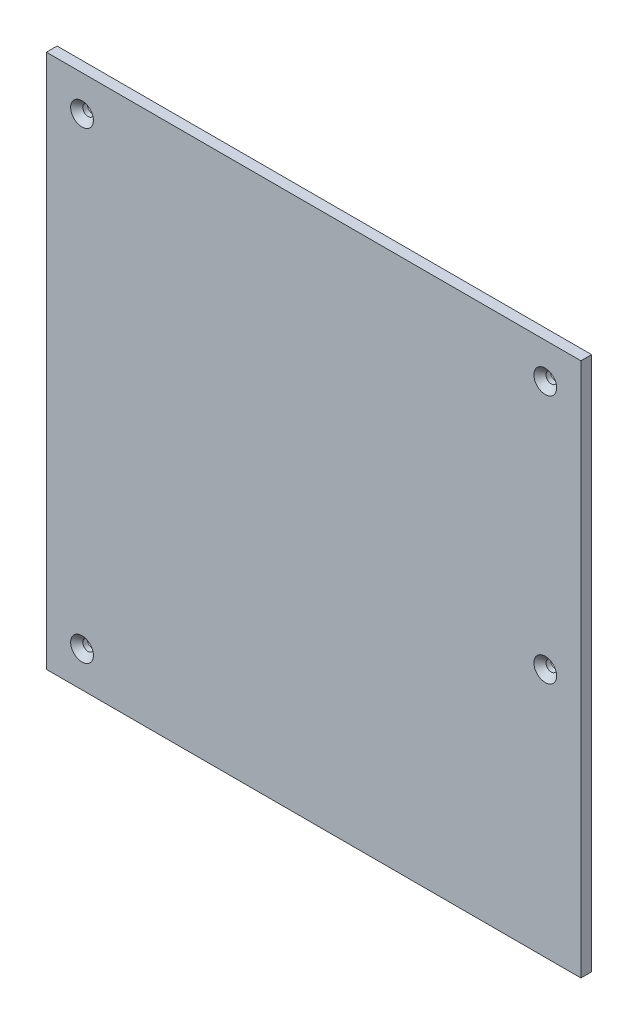
ISO-10303-21;
HEADER;
FILE_DESCRIPTION(('STEP AP214'),'2;1');
FILE_NAME('part.step','',(''),(''),'','','');
FILE_SCHEMA(('AUTOMOTIVE_DESIGN { 1 0 10303 214 1 1 1 1 }'));
ENDSEC;
DATA;
#1=APPLICATION_CONTEXT('core data for automotive mechanical design processes');
#2=APPLICATION_PROTOCOL_DEFINITION('international standard','automotive_design',2000,#1);
#3=PRODUCT_CONTEXT('',#1,'mechanical');
#4=PRODUCT('Part','Part','',(#3));
#5=PRODUCT_RELATED_PRODUCT_CATEGORY('part','',(#4));
#6=PRODUCT_DEFINITION_FORMATION('','',#4);
#7=PRODUCT_DEFINITION_CONTEXT('part definition',#1,'design');
#8=PRODUCT_DEFINITION('design','',#6,#7);
#9=PRODUCT_DEFINITION_SHAPE('','',#8);
#10=(LENGTH_UNIT() NAMED_UNIT(*) SI_UNIT(.MILLI.,.METRE.));
#11=(NAMED_UNIT(*) PLANE_ANGLE_UNIT() SI_UNIT($,.RADIAN.));
#12=(NAMED_UNIT(*) SI_UNIT($,.STERADIAN.) SOLID_ANGLE_UNIT());
#13=UNCERTAINTY_MEASURE_WITH_UNIT(LENGTH_MEASURE(1.E-05),#10,'distance_accuracy_value','');
#14=(GEOMETRIC_REPRESENTATION_CONTEXT(3) GLOBAL_UNCERTAINTY_ASSIGNED_CONTEXT((#13)) GLOBAL_UNIT_ASSIGNED_CONTEXT((#10,
#11,#12)) REPRESENTATION_CONTEXT('',''));
#15=CARTESIAN_POINT('',(0.,0.,0.));
#16=DIRECTION('',(0.,0.,1.));
#17=DIRECTION('',(1.,0.,0.));
#18=AXIS2_PLACEMENT_3D('',#15,#16,#17);
#19=CARTESIAN_POINT('',(75.,75.,3.));
#20=DIRECTION('',(-1.,0.,0.));
#21=DIRECTION('',(0.,-1.,0.));
#22=AXIS2_PLACEMENT_3D('',#19,#20,#21);
#23=PLANE('',#22);
#24=DIRECTION('',(0.,1.,0.));
#25=VECTOR('',#24,1.);
#26=CARTESIAN_POINT('',(75.,75.,0.));
#27=LINE('',#26,#25);
#28=CARTESIAN_POINT('',(75.,-75.,0.));
#29=VERTEX_POINT('',#28);
#30=CARTESIAN_POINT('',(75.,75.,0.));
#31=VERTEX_POINT('',#30);
#32=EDGE_CURVE('E103',#29,#31,#27,.T.);
#33=ORIENTED_EDGE('',*,*,#32,.T.);
#34=DIRECTION('',(0.,0.,-1.));
#35=VECTOR('',#34,1.);
#36=CARTESIAN_POINT('',(75.,75.,3.));
#37=LINE('',#36,#35);
#38=CARTESIAN_POINT('',(75.,75.,3.));
#39=VERTEX_POINT('',#38);
#40=EDGE_CURVE('E94',#39,#31,#37,.T.);
#41=ORIENTED_EDGE('',*,*,#40,.F.);
#42=DIRECTION('',(0.,1.,0.));
#43=VECTOR('',#42,1.);
#44=CARTESIAN_POINT('',(75.,75.,3.));
#45=LINE('',#44,#43);
#46=CARTESIAN_POINT('',(75.,-75.,3.));
#47=VERTEX_POINT('',#46);
#48=EDGE_CURVE('E88',#47,#39,#45,.T.);
#49=ORIENTED_EDGE('',*,*,#48,.F.);
#50=DIRECTION('',(0.,0.,-1.));
#51=VECTOR('',#50,1.);
#52=CARTESIAN_POINT('',(75.,-75.,3.));
#53=LINE('',#52,#51);
#54=EDGE_CURVE('E99',#47,#29,#53,.T.);
#55=ORIENTED_EDGE('',*,*,#54,.T.);
#56=EDGE_LOOP('',(#33,#41,#49,#55));
#57=FACE_BOUND('',#56,.T.);
#58=ADVANCED_FACE('F35',(#57),#23,.F.);
#59=CARTESIAN_POINT('',(-75.,75.,3.));
#60=DIRECTION('',(0.,-1.,0.));
#61=DIRECTION('',(0.,0.,-1.));
#62=AXIS2_PLACEMENT_3D('',#59,#60,#61);
#63=PLANE('',#62);
#64=DIRECTION('',(-1.,0.,0.));
#65=VECTOR('',#64,1.);
#66=CARTESIAN_POINT('',(-75.,75.,0.));
#67=LINE('',#66,#65);
#68=CARTESIAN_POINT('',(-75.,75.,0.));
#69=VERTEX_POINT('',#68);
#70=EDGE_CURVE('E93',#31,#69,#67,.T.);
#71=ORIENTED_EDGE('',*,*,#70,.T.);
#72=DIRECTION('',(0.,0.,-1.));
#73=VECTOR('',#72,1.);
#74=CARTESIAN_POINT('',(-75.,75.,3.));
#75=LINE('',#74,#73);
#76=CARTESIAN_POINT('',(-75.,75.,3.));
#77=VERTEX_POINT('',#76);
#78=EDGE_CURVE('E91',#77,#69,#75,.T.);
#79=ORIENTED_EDGE('',*,*,#78,.F.);
#80=DIRECTION('',(-1.,0.,0.));
#81=VECTOR('',#80,1.);
#82=CARTESIAN_POINT('',(-75.,75.,3.));
#83=LINE('',#82,#81);
#84=EDGE_CURVE('E83',#39,#77,#83,.T.);
#85=ORIENTED_EDGE('',*,*,#84,.F.);
#86=ORIENTED_EDGE('',*,*,#40,.T.);
#87=EDGE_LOOP('',(#71,#79,#85,#86));
#88=FACE_BOUND('',#87,.T.);
#89=ADVANCED_FACE('F92',(#88),#63,.F.);
#90=CARTESIAN_POINT('',(-75.,75.,3.));
#91=DIRECTION('',(1.,0.,0.));
#92=DIRECTION('',(0.,1.,0.));
#93=AXIS2_PLACEMENT_3D('',#90,#91,#92);
#94=PLANE('',#93);
#95=DIRECTION('',(0.,-1.,0.));
#96=VECTOR('',#95,1.);
#97=CARTESIAN_POINT('',(-75.,75.,0.));
#98=LINE('',#97,#96);
#99=CARTESIAN_POINT('',(-75.,-75.,0.));
#100=VERTEX_POINT('',#99);
#101=EDGE_CURVE('E69',#69,#100,#98,.T.);
#102=ORIENTED_EDGE('',*,*,#101,.T.);
#103=DIRECTION('',(0.,0.,-1.));
#104=VECTOR('',#103,1.);
#105=CARTESIAN_POINT('',(-75.,-75.,3.));
#106=LINE('',#105,#104);
#107=CARTESIAN_POINT('',(-75.,-75.,3.));
#108=VERTEX_POINT('',#107);
#109=EDGE_CURVE('E95',#108,#100,#106,.T.);
#110=ORIENTED_EDGE('',*,*,#109,.F.);
#111=DIRECTION('',(0.,-1.,0.));
#112=VECTOR('',#111,1.);
#113=CARTESIAN_POINT('',(-75.,75.,3.));
#114=LINE('',#113,#112);
#115=EDGE_CURVE('E86',#77,#108,#114,.T.);
#116=ORIENTED_EDGE('',*,*,#115,.F.);
#117=ORIENTED_EDGE('',*,*,#78,.T.);
#118=EDGE_LOOP('',(#102,#110,#116,#117));
#119=FACE_BOUND('',#118,.T.);
#120=ADVANCED_FACE('F97',(#119),#94,.F.);
#121=CARTESIAN_POINT('',(-75.,-75.,3.));
#122=DIRECTION('',(0.,1.,0.));
#123=DIRECTION('',(0.,0.,1.));
#124=AXIS2_PLACEMENT_3D('',#121,#122,#123);
#125=PLANE('',#124);
#126=DIRECTION('',(1.,0.,0.));
#127=VECTOR('',#126,1.);
#128=CARTESIAN_POINT('',(-75.,-75.,0.));
#129=LINE('',#128,#127);
#130=EDGE_CURVE('E75',#100,#29,#129,.T.);
#131=ORIENTED_EDGE('',*,*,#130,.T.);
#132=ORIENTED_EDGE('',*,*,#54,.F.);
#133=DIRECTION('',(1.,0.,0.));
#134=VECTOR('',#133,1.);
#135=CARTESIAN_POINT('',(-75.,-75.,3.));
#136=LINE('',#135,#134);
#137=EDGE_CURVE('E52',#108,#47,#136,.T.);
#138=ORIENTED_EDGE('',*,*,#137,.F.);
#139=ORIENTED_EDGE('',*,*,#109,.T.);
#140=EDGE_LOOP('',(#131,#132,#138,#139));
#141=FACE_BOUND('',#140,.T.);
#142=ADVANCED_FACE('F145',(#141),#125,.F.);
#143=CARTESIAN_POINT('',(0.,0.,3.));
#144=DIRECTION('',(0.,0.,1.));
#145=DIRECTION('',(1.,0.,0.));
#146=AXIS2_PLACEMENT_3D('',#143,#144,#145);
#147=PLANE('',#146);
#148=CARTESIAN_POINT('',(-65.,-65.,3.));
#149=DIRECTION('',(0.,0.,1.));
#150=DIRECTION('',(1.,0.,0.));
#151=AXIS2_PLACEMENT_3D('',#148,#149,#150);
#152=CIRCLE('',#151,3.20000000000001);
#153=CARTESIAN_POINT('',(-61.8,-65.,3.));
#154=VERTEX_POINT('',#153);
#155=EDGE_CURVE('E122',#154,#154,#152,.F.);
#156=ORIENTED_EDGE('',*,*,#155,.T.);
#157=EDGE_LOOP('',(#156));
#158=FACE_BOUND('',#157,.T.);
#159=CARTESIAN_POINT('',(65.,-5.,3.));
#160=DIRECTION('',(0.,0.,1.));
#161=DIRECTION('',(1.,0.,0.));
#162=AXIS2_PLACEMENT_3D('',#159,#160,#161);
#163=CIRCLE('',#162,3.19999999999997);
#164=CARTESIAN_POINT('',(68.2,-5.,3.));
#165=VERTEX_POINT('',#164);
#166=EDGE_CURVE('E119',#165,#165,#163,.F.);
#167=ORIENTED_EDGE('',*,*,#166,.T.);
#168=EDGE_LOOP('',(#167));
#169=FACE_BOUND('',#168,.T.);
#170=CARTESIAN_POINT('',(65.,65.,3.));
#171=DIRECTION('',(0.,0.,1.));
#172=DIRECTION('',(1.,0.,0.));
#173=AXIS2_PLACEMENT_3D('',#170,#171,#172);
#174=CIRCLE('',#173,3.19999999999999);
#175=CARTESIAN_POINT('',(68.2,65.,3.));
#176=VERTEX_POINT('',#175);
#177=EDGE_CURVE('E116',#176,#176,#174,.F.);
#178=ORIENTED_EDGE('',*,*,#177,.T.);
#179=EDGE_LOOP('',(#178));
#180=FACE_BOUND('',#179,.T.);
#181=CARTESIAN_POINT('',(-65.,65.,3.));
#182=DIRECTION('',(0.,0.,1.));
#183=DIRECTION('',(1.,0.,0.));
#184=AXIS2_PLACEMENT_3D('',#181,#182,#183);
#185=CIRCLE('',#184,3.20000000000001);
#186=CARTESIAN_POINT('',(-61.8,65.,3.));
#187=VERTEX_POINT('',#186);
#188=EDGE_CURVE('E113',#187,#187,#185,.F.);
#189=ORIENTED_EDGE('',*,*,#188,.T.);
#190=EDGE_LOOP('',(#189));
#191=FACE_BOUND('',#190,.T.);
#192=ORIENTED_EDGE('',*,*,#48,.T.);
#193=ORIENTED_EDGE('',*,*,#84,.T.);
#194=ORIENTED_EDGE('',*,*,#115,.T.);
#195=ORIENTED_EDGE('',*,*,#137,.T.);
#196=EDGE_LOOP('',(#192,#193,#194,#195));
#197=FACE_BOUND('',#196,.T.);
#198=ADVANCED_FACE('F84',(#158,#169,#180,#191,#197),#147,.T.);
#199=CARTESIAN_POINT('',(0.,0.,0.));
#200=DIRECTION('',(0.,0.,1.));
#201=DIRECTION('',(1.,0.,0.));
#202=AXIS2_PLACEMENT_3D('',#199,#200,#201);
#203=PLANE('',#202);
#204=CARTESIAN_POINT('',(-65.,-65.,0.));
#205=DIRECTION('',(0.,0.,-1.));
#206=DIRECTION('',(-1.,0.,0.));
#207=AXIS2_PLACEMENT_3D('',#204,#205,#206);
#208=CIRCLE('',#207,1.5);
#209=CARTESIAN_POINT('',(-66.5,-65.,0.));
#210=VERTEX_POINT('',#209);
#211=EDGE_CURVE('E106',#210,#210,#208,.T.);
#212=ORIENTED_EDGE('',*,*,#211,.F.);
#213=EDGE_LOOP('',(#212));
#214=FACE_BOUND('',#213,.T.);
#215=CARTESIAN_POINT('',(-65.,65.,0.));
#216=DIRECTION('',(0.,0.,-1.));
#217=DIRECTION('',(-1.,0.,0.));
#218=AXIS2_PLACEMENT_3D('',#215,#216,#217);
#219=CIRCLE('',#218,1.5);
#220=CARTESIAN_POINT('',(-66.5,65.,0.));
#221=VERTEX_POINT('',#220);
#222=EDGE_CURVE('E189',#221,#221,#219,.T.);
#223=ORIENTED_EDGE('',*,*,#222,.F.);
#224=EDGE_LOOP('',(#223));
#225=FACE_BOUND('',#224,.T.);
#226=CARTESIAN_POINT('',(65.,65.,0.));
#227=DIRECTION('',(0.,0.,-1.));
#228=DIRECTION('',(-1.,0.,0.));
#229=AXIS2_PLACEMENT_3D('',#226,#227,#228);
#230=CIRCLE('',#229,1.5);
#231=CARTESIAN_POINT('',(63.5,65.,0.));
#232=VERTEX_POINT('',#231);
#233=EDGE_CURVE('E186',#232,#232,#230,.T.);
#234=ORIENTED_EDGE('',*,*,#233,.F.);
#235=EDGE_LOOP('',(#234));
#236=FACE_BOUND('',#235,.T.);
#237=CARTESIAN_POINT('',(65.,-5.,0.));
#238=DIRECTION('',(0.,0.,-1.));
#239=DIRECTION('',(-1.,0.,0.));
#240=AXIS2_PLACEMENT_3D('',#237,#238,#239);
#241=CIRCLE('',#240,1.5);
#242=CARTESIAN_POINT('',(63.5,-5.,0.));
#243=VERTEX_POINT('',#242);
#244=EDGE_CURVE('E184',#243,#243,#241,.T.);
#245=ORIENTED_EDGE('',*,*,#244,.F.);
#246=EDGE_LOOP('',(#245));
#247=FACE_BOUND('',#246,.T.);
#248=ORIENTED_EDGE('',*,*,#32,.F.);
#249=ORIENTED_EDGE('',*,*,#130,.F.);
#250=ORIENTED_EDGE('',*,*,#101,.F.);
#251=ORIENTED_EDGE('',*,*,#70,.F.);
#252=EDGE_LOOP('',(#248,#249,#250,#251));
#253=FACE_BOUND('',#252,.T.);
#254=ADVANCED_FACE('F144',(#214,#225,#236,#247,#253),#203,.F.);
#255=CARTESIAN_POINT('',(65.,-5.,7.24264068711929));
#256=DIRECTION('',(0.,0.,-1.));
#257=DIRECTION('',(-1.,0.,0.));
#258=AXIS2_PLACEMENT_3D('',#255,#256,#257);
#259=CYLINDRICAL_SURFACE('',#258,1.5);
#260=CARTESIAN_POINT('',(65.,-5.,1.30000000000001));
#261=DIRECTION('',(0.,0.,1.));
#262=DIRECTION('',(1.,0.,0.));
#263=AXIS2_PLACEMENT_3D('',#260,#261,#262);
#264=CIRCLE('',#263,1.5);
#265=CARTESIAN_POINT('',(66.5,-5.,1.30000000000001));
#266=VERTEX_POINT('',#265);
#267=EDGE_CURVE('E128',#266,#266,#264,.T.);
#268=ORIENTED_EDGE('',*,*,#267,.T.);
#269=EDGE_LOOP('',(#268));
#270=FACE_BOUND('',#269,.T.);
#271=ORIENTED_EDGE('',*,*,#244,.T.);
#272=EDGE_LOOP('',(#271));
#273=FACE_BOUND('',#272,.T.);
#274=ADVANCED_FACE('F178',(#270,#273),#259,.F.);
#275=CARTESIAN_POINT('',(65.,65.,7.24264068711929));
#276=DIRECTION('',(0.,0.,-1.));
#277=DIRECTION('',(-1.,0.,0.));
#278=AXIS2_PLACEMENT_3D('',#275,#276,#277);
#279=CYLINDRICAL_SURFACE('',#278,1.5);
#280=CARTESIAN_POINT('',(65.,65.,1.29999999999998));
#281=DIRECTION('',(0.,0.,1.));
#282=DIRECTION('',(1.,0.,0.));
#283=AXIS2_PLACEMENT_3D('',#280,#281,#282);
#284=CIRCLE('',#283,1.5);
#285=CARTESIAN_POINT('',(66.5,65.,1.29999999999998));
#286=VERTEX_POINT('',#285);
#287=EDGE_CURVE('E44',#286,#286,#284,.T.);
#288=ORIENTED_EDGE('',*,*,#287,.T.);
#289=EDGE_LOOP('',(#288));
#290=FACE_BOUND('',#289,.T.);
#291=ORIENTED_EDGE('',*,*,#233,.T.);
#292=EDGE_LOOP('',(#291));
#293=FACE_BOUND('',#292,.T.);
#294=ADVANCED_FACE('F133',(#290,#293),#279,.F.);
#295=CARTESIAN_POINT('',(-65.,65.,7.24264068711929));
#296=DIRECTION('',(0.,0.,-1.));
#297=DIRECTION('',(-1.,0.,0.));
#298=AXIS2_PLACEMENT_3D('',#295,#296,#297);
#299=CYLINDRICAL_SURFACE('',#298,1.5);
#300=CARTESIAN_POINT('',(-65.,65.,1.29999999999998));
#301=DIRECTION('',(0.,0.,1.));
#302=DIRECTION('',(1.,0.,0.));
#303=AXIS2_PLACEMENT_3D('',#300,#301,#302);
#304=CIRCLE('',#303,1.5);
#305=CARTESIAN_POINT('',(-63.5,65.,1.29999999999998));
#306=VERTEX_POINT('',#305);
#307=EDGE_CURVE('E11',#306,#306,#304,.T.);
#308=ORIENTED_EDGE('',*,*,#307,.T.);
#309=EDGE_LOOP('',(#308));
#310=FACE_BOUND('',#309,.T.);
#311=ORIENTED_EDGE('',*,*,#222,.T.);
#312=EDGE_LOOP('',(#311));
#313=FACE_BOUND('',#312,.T.);
#314=ADVANCED_FACE('F215',(#310,#313),#299,.F.);
#315=CARTESIAN_POINT('',(-65.,-65.,7.24264068711929));
#316=DIRECTION('',(0.,0.,-1.));
#317=DIRECTION('',(-1.,0.,0.));
#318=AXIS2_PLACEMENT_3D('',#315,#316,#317);
#319=CYLINDRICAL_SURFACE('',#318,1.5);
#320=CARTESIAN_POINT('',(-65.,-65.,1.29999999999998));
#321=DIRECTION('',(0.,0.,1.));
#322=DIRECTION('',(1.,0.,0.));
#323=AXIS2_PLACEMENT_3D('',#320,#321,#322);
#324=CIRCLE('',#323,1.5);
#325=CARTESIAN_POINT('',(-63.5,-65.,1.29999999999998));
#326=VERTEX_POINT('',#325);
#327=EDGE_CURVE('E125',#326,#326,#324,.T.);
#328=ORIENTED_EDGE('',*,*,#327,.T.);
#329=EDGE_LOOP('',(#328));
#330=FACE_BOUND('',#329,.T.);
#331=ORIENTED_EDGE('',*,*,#211,.T.);
#332=EDGE_LOOP('',(#331));
#333=FACE_BOUND('',#332,.T.);
#334=ADVANCED_FACE('F167',(#330,#333),#319,.F.);
#335=CARTESIAN_POINT('',(-65.,-65.,3.));
#336=DIRECTION('',(0.,0.,1.));
#337=DIRECTION('',(1.,0.,0.));
#338=AXIS2_PLACEMENT_3D('',#335,#336,#337);
#339=CONICAL_SURFACE('',#338,3.20000000000001,0.785398163397447);
#340=ORIENTED_EDGE('',*,*,#327,.F.);
#341=EDGE_LOOP('',(#340));
#342=FACE_BOUND('',#341,.T.);
#343=ORIENTED_EDGE('',*,*,#155,.F.);
#344=EDGE_LOOP('',(#343));
#345=FACE_BOUND('',#344,.T.);
#346=ADVANCED_FACE('F164',(#342,#345),#339,.F.);
#347=CARTESIAN_POINT('',(65.,-5.,3.));
#348=DIRECTION('',(0.,0.,1.));
#349=DIRECTION('',(1.,0.,0.));
#350=AXIS2_PLACEMENT_3D('',#347,#348,#349);
#351=CONICAL_SURFACE('',#350,3.19999999999997,0.785398163397445);
#352=ORIENTED_EDGE('',*,*,#267,.F.);
#353=EDGE_LOOP('',(#352));
#354=FACE_BOUND('',#353,.T.);
#355=ORIENTED_EDGE('',*,*,#166,.F.);
#356=EDGE_LOOP('',(#355));
#357=FACE_BOUND('',#356,.T.);
#358=ADVANCED_FACE('F139',(#354,#357),#351,.F.);
#359=CARTESIAN_POINT('',(65.,65.,3.));
#360=DIRECTION('',(0.,0.,1.));
#361=DIRECTION('',(1.,0.,0.));
#362=AXIS2_PLACEMENT_3D('',#359,#360,#361);
#363=CONICAL_SURFACE('',#362,3.2,0.785398163397445);
#364=ORIENTED_EDGE('',*,*,#287,.F.);
#365=EDGE_LOOP('',(#364));
#366=FACE_BOUND('',#365,.T.);
#367=ORIENTED_EDGE('',*,*,#177,.F.);
#368=EDGE_LOOP('',(#367));
#369=FACE_BOUND('',#368,.T.);
#370=ADVANCED_FACE('F136',(#366,#369),#363,.F.);
#371=CARTESIAN_POINT('',(-65.,65.,3.));
#372=DIRECTION('',(0.,0.,1.));
#373=DIRECTION('',(1.,0.,0.));
#374=AXIS2_PLACEMENT_3D('',#371,#372,#373);
#375=CONICAL_SURFACE('',#374,3.20000000000001,0.785398163397447);
#376=ORIENTED_EDGE('',*,*,#307,.F.);
#377=EDGE_LOOP('',(#376));
#378=FACE_BOUND('',#377,.T.);
#379=ORIENTED_EDGE('',*,*,#188,.F.);
#380=EDGE_LOOP('',(#379));
#381=FACE_BOUND('',#380,.T.);
#382=ADVANCED_FACE('F37',(#378,#381),#375,.F.);
#383=CLOSED_SHELL('',(#58,#89,#120,#142,#198,#254,#274,#294,#314,#334,#346,#358,#370,#382));
#384=MANIFOLD_SOLID_BREP('B2',#383);
#385=ADVANCED_BREP_SHAPE_REPRESENTATION('',(#18,#384),#14);
#386=SHAPE_DEFINITION_REPRESENTATION(#9,#385);
ENDSEC;
END-ISO-10303-21;
